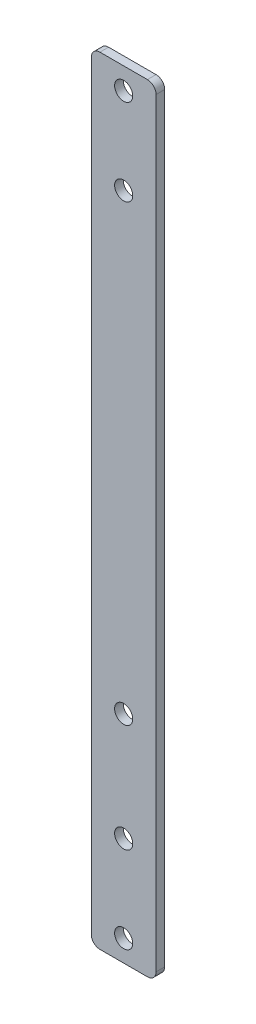
ISO-10303-21;
HEADER;
FILE_DESCRIPTION(('STEP AP214'),'2;1');
FILE_NAME('part.step','',(''),(''),'','','');
FILE_SCHEMA(('AUTOMOTIVE_DESIGN { 1 0 10303 214 1 1 1 1 }'));
ENDSEC;
DATA;
#1=APPLICATION_CONTEXT('core data for automotive mechanical design processes');
#2=APPLICATION_PROTOCOL_DEFINITION('international standard','automotive_design',2000,#1);
#3=PRODUCT_CONTEXT('',#1,'mechanical');
#4=PRODUCT('Part','Part','',(#3));
#5=PRODUCT_RELATED_PRODUCT_CATEGORY('part','',(#4));
#6=PRODUCT_DEFINITION_FORMATION('','',#4);
#7=PRODUCT_DEFINITION_CONTEXT('part definition',#1,'design');
#8=PRODUCT_DEFINITION('design','',#6,#7);
#9=PRODUCT_DEFINITION_SHAPE('','',#8);
#10=(LENGTH_UNIT() NAMED_UNIT(*) SI_UNIT(.MILLI.,.METRE.));
#11=(NAMED_UNIT(*) PLANE_ANGLE_UNIT() SI_UNIT($,.RADIAN.));
#12=(NAMED_UNIT(*) SI_UNIT($,.STERADIAN.) SOLID_ANGLE_UNIT());
#13=UNCERTAINTY_MEASURE_WITH_UNIT(LENGTH_MEASURE(1.E-05),#10,'distance_accuracy_value','');
#14=(GEOMETRIC_REPRESENTATION_CONTEXT(3) GLOBAL_UNCERTAINTY_ASSIGNED_CONTEXT((#13)) GLOBAL_UNIT_ASSIGNED_CONTEXT((#10,
#11,#12)) REPRESENTATION_CONTEXT('',''));
#15=CARTESIAN_POINT('',(0.,0.,0.));
#16=DIRECTION('',(0.,0.,1.));
#17=DIRECTION('',(1.,0.,0.));
#18=AXIS2_PLACEMENT_3D('',#15,#16,#17);
#19=CARTESIAN_POINT('',(-5.50000000000002,173.,2.));
#20=DIRECTION('',(0.,0.,1.));
#21=DIRECTION('',(1.,0.,0.));
#22=AXIS2_PLACEMENT_3D('',#19,#20,#21);
#23=PLANE('',#22);
#24=CARTESIAN_POINT('',(0.,45.,2.));
#25=DIRECTION('',(0.,0.,1.));
#26=DIRECTION('',(1.,0.,0.));
#27=AXIS2_PLACEMENT_3D('',#24,#25,#26);
#28=CIRCLE('',#27,2.1);
#29=CARTESIAN_POINT('',(2.1,45.,2.));
#30=VERTEX_POINT('',#29);
#31=EDGE_CURVE('E358',#30,#30,#28,.T.);
#32=ORIENTED_EDGE('',*,*,#31,.F.);
#33=EDGE_LOOP('',(#32));
#34=FACE_BOUND('',#33,.T.);
#35=CARTESIAN_POINT('',(0.,20.,2.));
#36=DIRECTION('',(0.,0.,1.));
#37=DIRECTION('',(1.,0.,0.));
#38=AXIS2_PLACEMENT_3D('',#35,#36,#37);
#39=CIRCLE('',#38,2.1);
#40=CARTESIAN_POINT('',(2.1,20.,2.));
#41=VERTEX_POINT('',#40);
#42=EDGE_CURVE('E347',#41,#41,#39,.F.);
#43=ORIENTED_EDGE('',*,*,#42,.T.);
#44=EDGE_LOOP('',(#43));
#45=FACE_BOUND('',#44,.T.);
#46=CARTESIAN_POINT('',(0.,0.,2.));
#47=DIRECTION('',(0.,0.,1.));
#48=DIRECTION('',(1.,0.,0.));
#49=AXIS2_PLACEMENT_3D('',#46,#47,#48);
#50=CIRCLE('',#49,2.10000000000001);
#51=CARTESIAN_POINT('',(2.09999999999994,0.,2.));
#52=VERTEX_POINT('',#51);
#53=EDGE_CURVE('E339',#52,#52,#50,.F.);
#54=ORIENTED_EDGE('',*,*,#53,.T.);
#55=EDGE_LOOP('',(#54));
#56=FACE_BOUND('',#55,.T.);
#57=CARTESIAN_POINT('',(0.,170.,2.));
#58=DIRECTION('',(0.,0.,1.));
#59=DIRECTION('',(1.,0.,0.));
#60=AXIS2_PLACEMENT_3D('',#57,#58,#59);
#61=CIRCLE('',#60,2.1);
#62=CARTESIAN_POINT('',(2.1,170.,2.));
#63=VERTEX_POINT('',#62);
#64=EDGE_CURVE('E260',#63,#63,#61,.T.);
#65=ORIENTED_EDGE('',*,*,#64,.F.);
#66=EDGE_LOOP('',(#65));
#67=FACE_BOUND('',#66,.T.);
#68=CARTESIAN_POINT('',(-5.50000000000002,173.,2.));
#69=DIRECTION('',(0.,0.,1.));
#70=DIRECTION('',(1.,0.,0.));
#71=AXIS2_PLACEMENT_3D('',#68,#69,#70);
#72=CIRCLE('',#71,2.);
#73=CARTESIAN_POINT('',(-5.50000000000001,175.,2.));
#74=VERTEX_POINT('',#73);
#75=CARTESIAN_POINT('',(-7.50000000000002,173.,2.));
#76=VERTEX_POINT('',#75);
#77=EDGE_CURVE('E282',#74,#76,#72,.T.);
#78=ORIENTED_EDGE('',*,*,#77,.T.);
#79=DIRECTION('',(0.,-1.,0.));
#80=VECTOR('',#79,1.);
#81=CARTESIAN_POINT('',(-7.50000000000002,173.,2.));
#82=LINE('',#81,#80);
#83=CARTESIAN_POINT('',(-7.50000000000006,-3.00000000000004,2.));
#84=VERTEX_POINT('',#83);
#85=EDGE_CURVE('E210',#76,#84,#82,.T.);
#86=ORIENTED_EDGE('',*,*,#85,.T.);
#87=CARTESIAN_POINT('',(-5.50000000000006,-3.00000000000006,2.));
#88=DIRECTION('',(0.,0.,1.));
#89=DIRECTION('',(1.,0.,0.));
#90=AXIS2_PLACEMENT_3D('',#87,#88,#89);
#91=CIRCLE('',#90,2.);
#92=CARTESIAN_POINT('',(-5.50000000000005,-5.00000000000006,2.));
#93=VERTEX_POINT('',#92);
#94=EDGE_CURVE('E304',#84,#93,#91,.T.);
#95=ORIENTED_EDGE('',*,*,#94,.T.);
#96=DIRECTION('',(1.,0.,0.));
#97=VECTOR('',#96,1.);
#98=CARTESIAN_POINT('',(-5.50000000000005,-5.00000000000006,2.));
#99=LINE('',#98,#97);
#100=CARTESIAN_POINT('',(5.5,-5.00000000000008,2.));
#101=VERTEX_POINT('',#100);
#102=EDGE_CURVE('E317',#93,#101,#99,.T.);
#103=ORIENTED_EDGE('',*,*,#102,.T.);
#104=CARTESIAN_POINT('',(5.50000000000002,-3.00000000000008,2.));
#105=DIRECTION('',(0.,0.,1.));
#106=DIRECTION('',(1.,0.,0.));
#107=AXIS2_PLACEMENT_3D('',#104,#105,#106);
#108=CIRCLE('',#107,2.);
#109=CARTESIAN_POINT('',(7.50000000000002,-3.00000000000008,2.));
#110=VERTEX_POINT('',#109);
#111=EDGE_CURVE('E244',#101,#110,#108,.T.);
#112=ORIENTED_EDGE('',*,*,#111,.T.);
#113=DIRECTION('',(0.,-1.,0.));
#114=VECTOR('',#113,1.);
#115=CARTESIAN_POINT('',(7.50000000000002,173.,2.));
#116=LINE('',#115,#114);
#117=CARTESIAN_POINT('',(7.50000000000002,173.,2.));
#118=VERTEX_POINT('',#117);
#119=EDGE_CURVE('E229',#118,#110,#116,.T.);
#120=ORIENTED_EDGE('',*,*,#119,.F.);
#121=CARTESIAN_POINT('',(5.50000000000002,173.,2.));
#122=DIRECTION('',(0.,0.,-1.));
#123=DIRECTION('',(-1.,0.,0.));
#124=AXIS2_PLACEMENT_3D('',#121,#122,#123);
#125=CIRCLE('',#124,2.);
#126=CARTESIAN_POINT('',(5.50000000000001,175.,2.));
#127=VERTEX_POINT('',#126);
#128=EDGE_CURVE('E242',#127,#118,#125,.T.);
#129=ORIENTED_EDGE('',*,*,#128,.F.);
#130=DIRECTION('',(1.,0.,0.));
#131=VECTOR('',#130,1.);
#132=CARTESIAN_POINT('',(-5.50000000000001,175.,2.));
#133=LINE('',#132,#131);
#134=EDGE_CURVE('E250',#74,#127,#133,.T.);
#135=ORIENTED_EDGE('',*,*,#134,.F.);
#136=EDGE_LOOP('',(#78,#86,#95,#103,#112,#120,#129,#135));
#137=FACE_BOUND('',#136,.T.);
#138=CARTESIAN_POINT('',(0.,150.,2.));
#139=DIRECTION('',(0.,0.,1.));
#140=DIRECTION('',(1.,0.,0.));
#141=AXIS2_PLACEMENT_3D('',#138,#139,#140);
#142=CIRCLE('',#141,2.1);
#143=CARTESIAN_POINT('',(2.1,150.,2.));
#144=VERTEX_POINT('',#143);
#145=EDGE_CURVE('E331',#144,#144,#142,.T.);
#146=ORIENTED_EDGE('',*,*,#145,.F.);
#147=EDGE_LOOP('',(#146));
#148=FACE_BOUND('',#147,.T.);
#149=ADVANCED_FACE('F153',(#34,#45,#56,#67,#137,#148),#23,.T.);
#150=CARTESIAN_POINT('',(-5.50000000000002,173.,0.));
#151=DIRECTION('',(0.,0.,1.));
#152=DIRECTION('',(1.,0.,0.));
#153=AXIS2_PLACEMENT_3D('',#150,#151,#152);
#154=PLANE('',#153);
#155=CARTESIAN_POINT('',(0.,45.,0.));
#156=DIRECTION('',(0.,0.,1.));
#157=DIRECTION('',(1.,0.,0.));
#158=AXIS2_PLACEMENT_3D('',#155,#156,#157);
#159=CIRCLE('',#158,2.1);
#160=CARTESIAN_POINT('',(2.1,45.,0.));
#161=VERTEX_POINT('',#160);
#162=EDGE_CURVE('E157',#161,#161,#159,.T.);
#163=ORIENTED_EDGE('',*,*,#162,.T.);
#164=EDGE_LOOP('',(#163));
#165=FACE_BOUND('',#164,.T.);
#166=CARTESIAN_POINT('',(0.,20.,0.));
#167=DIRECTION('',(0.,0.,1.));
#168=DIRECTION('',(1.,0.,0.));
#169=AXIS2_PLACEMENT_3D('',#166,#167,#168);
#170=CIRCLE('',#169,2.1);
#171=CARTESIAN_POINT('',(2.1,20.,0.));
#172=VERTEX_POINT('',#171);
#173=EDGE_CURVE('E351',#172,#172,#170,.F.);
#174=ORIENTED_EDGE('',*,*,#173,.F.);
#175=EDGE_LOOP('',(#174));
#176=FACE_BOUND('',#175,.T.);
#177=CARTESIAN_POINT('',(0.,0.,0.));
#178=DIRECTION('',(0.,0.,1.));
#179=DIRECTION('',(1.,0.,0.));
#180=AXIS2_PLACEMENT_3D('',#177,#178,#179);
#181=CIRCLE('',#180,2.10000000000001);
#182=CARTESIAN_POINT('',(2.09999999999994,0.,0.));
#183=VERTEX_POINT('',#182);
#184=EDGE_CURVE('E343',#183,#183,#181,.F.);
#185=ORIENTED_EDGE('',*,*,#184,.F.);
#186=EDGE_LOOP('',(#185));
#187=FACE_BOUND('',#186,.T.);
#188=CARTESIAN_POINT('',(-5.50000000000002,173.,0.));
#189=DIRECTION('',(0.,0.,1.));
#190=DIRECTION('',(1.,0.,0.));
#191=AXIS2_PLACEMENT_3D('',#188,#189,#190);
#192=CIRCLE('',#191,2.);
#193=CARTESIAN_POINT('',(-5.50000000000001,175.,0.));
#194=VERTEX_POINT('',#193);
#195=CARTESIAN_POINT('',(-7.50000000000002,173.,0.));
#196=VERTEX_POINT('',#195);
#197=EDGE_CURVE('E256',#194,#196,#192,.T.);
#198=ORIENTED_EDGE('',*,*,#197,.F.);
#199=DIRECTION('',(1.,0.,0.));
#200=VECTOR('',#199,1.);
#201=CARTESIAN_POINT('',(-5.50000000000001,175.,0.));
#202=LINE('',#201,#200);
#203=CARTESIAN_POINT('',(5.50000000000001,175.,0.));
#204=VERTEX_POINT('',#203);
#205=EDGE_CURVE('E278',#194,#204,#202,.T.);
#206=ORIENTED_EDGE('',*,*,#205,.T.);
#207=CARTESIAN_POINT('',(5.50000000000002,173.,0.));
#208=DIRECTION('',(0.,0.,-1.));
#209=DIRECTION('',(-1.,0.,0.));
#210=AXIS2_PLACEMENT_3D('',#207,#208,#209);
#211=CIRCLE('',#210,2.);
#212=CARTESIAN_POINT('',(7.50000000000002,173.,0.));
#213=VERTEX_POINT('',#212);
#214=EDGE_CURVE('E275',#204,#213,#211,.T.);
#215=ORIENTED_EDGE('',*,*,#214,.T.);
#216=DIRECTION('',(0.,-1.,0.));
#217=VECTOR('',#216,1.);
#218=CARTESIAN_POINT('',(7.50000000000002,173.,0.));
#219=LINE('',#218,#217);
#220=CARTESIAN_POINT('',(7.50000000000002,-3.00000000000008,0.));
#221=VERTEX_POINT('',#220);
#222=EDGE_CURVE('E231',#213,#221,#219,.T.);
#223=ORIENTED_EDGE('',*,*,#222,.T.);
#224=CARTESIAN_POINT('',(5.50000000000002,-3.00000000000008,0.));
#225=DIRECTION('',(0.,0.,1.));
#226=DIRECTION('',(1.,0.,0.));
#227=AXIS2_PLACEMENT_3D('',#224,#225,#226);
#228=CIRCLE('',#227,2.);
#229=CARTESIAN_POINT('',(5.5,-5.00000000000008,0.));
#230=VERTEX_POINT('',#229);
#231=EDGE_CURVE('E269',#230,#221,#228,.T.);
#232=ORIENTED_EDGE('',*,*,#231,.F.);
#233=DIRECTION('',(1.,0.,0.));
#234=VECTOR('',#233,1.);
#235=CARTESIAN_POINT('',(-5.50000000000005,-5.00000000000006,0.));
#236=LINE('',#235,#234);
#237=CARTESIAN_POINT('',(-5.50000000000005,-5.00000000000006,0.));
#238=VERTEX_POINT('',#237);
#239=EDGE_CURVE('E266',#238,#230,#236,.T.);
#240=ORIENTED_EDGE('',*,*,#239,.F.);
#241=CARTESIAN_POINT('',(-5.50000000000006,-3.00000000000006,0.));
#242=DIRECTION('',(0.,0.,1.));
#243=DIRECTION('',(1.,0.,0.));
#244=AXIS2_PLACEMENT_3D('',#241,#242,#243);
#245=CIRCLE('',#244,2.);
#246=CARTESIAN_POINT('',(-7.50000000000006,-3.00000000000004,0.));
#247=VERTEX_POINT('',#246);
#248=EDGE_CURVE('E263',#247,#238,#245,.T.);
#249=ORIENTED_EDGE('',*,*,#248,.F.);
#250=DIRECTION('',(0.,-1.,0.));
#251=VECTOR('',#250,1.);
#252=CARTESIAN_POINT('',(-7.50000000000002,173.,0.));
#253=LINE('',#252,#251);
#254=EDGE_CURVE('E259',#196,#247,#253,.T.);
#255=ORIENTED_EDGE('',*,*,#254,.F.);
#256=EDGE_LOOP('',(#198,#206,#215,#223,#232,#240,#249,#255));
#257=FACE_BOUND('',#256,.T.);
#258=CARTESIAN_POINT('',(0.,170.,0.));
#259=DIRECTION('',(0.,0.,1.));
#260=DIRECTION('',(1.,0.,0.));
#261=AXIS2_PLACEMENT_3D('',#258,#259,#260);
#262=CIRCLE('',#261,2.1);
#263=CARTESIAN_POINT('',(2.1,170.,0.));
#264=VERTEX_POINT('',#263);
#265=EDGE_CURVE('E327',#264,#264,#262,.T.);
#266=ORIENTED_EDGE('',*,*,#265,.T.);
#267=EDGE_LOOP('',(#266));
#268=FACE_BOUND('',#267,.T.);
#269=CARTESIAN_POINT('',(0.,150.,0.));
#270=DIRECTION('',(0.,0.,1.));
#271=DIRECTION('',(1.,0.,0.));
#272=AXIS2_PLACEMENT_3D('',#269,#270,#271);
#273=CIRCLE('',#272,2.1);
#274=CARTESIAN_POINT('',(2.1,150.,0.));
#275=VERTEX_POINT('',#274);
#276=EDGE_CURVE('E335',#275,#275,#273,.T.);
#277=ORIENTED_EDGE('',*,*,#276,.T.);
#278=EDGE_LOOP('',(#277));
#279=FACE_BOUND('',#278,.T.);
#280=ADVANCED_FACE('F307',(#165,#176,#187,#257,#268,#279),#154,.F.);
#281=CARTESIAN_POINT('',(-5.50000000000002,173.,2.));
#282=DIRECTION('',(0.,0.,-1.));
#283=DIRECTION('',(-1.,0.,0.));
#284=AXIS2_PLACEMENT_3D('',#281,#282,#283);
#285=CYLINDRICAL_SURFACE('',#284,2.);
#286=ORIENTED_EDGE('',*,*,#197,.T.);
#287=DIRECTION('',(0.,0.,-1.));
#288=VECTOR('',#287,1.);
#289=CARTESIAN_POINT('',(-7.50000000000002,173.,2.));
#290=LINE('',#289,#288);
#291=EDGE_CURVE('E12',#76,#196,#290,.T.);
#292=ORIENTED_EDGE('',*,*,#291,.F.);
#293=ORIENTED_EDGE('',*,*,#77,.F.);
#294=DIRECTION('',(0.,0.,-1.));
#295=VECTOR('',#294,1.);
#296=CARTESIAN_POINT('',(-5.50000000000001,175.,2.));
#297=LINE('',#296,#295);
#298=EDGE_CURVE('E172',#74,#194,#297,.T.);
#299=ORIENTED_EDGE('',*,*,#298,.T.);
#300=EDGE_LOOP('',(#286,#292,#293,#299));
#301=FACE_BOUND('',#300,.T.);
#302=ADVANCED_FACE('F155',(#301),#285,.T.);
#303=CARTESIAN_POINT('',(-7.50000000000002,173.,2.));
#304=DIRECTION('',(1.,0.,0.));
#305=DIRECTION('',(0.,1.,0.));
#306=AXIS2_PLACEMENT_3D('',#303,#304,#305);
#307=PLANE('',#306);
#308=ORIENTED_EDGE('',*,*,#254,.T.);
#309=DIRECTION('',(0.,0.,-1.));
#310=VECTOR('',#309,1.);
#311=CARTESIAN_POINT('',(-7.50000000000006,-3.00000000000004,2.));
#312=LINE('',#311,#310);
#313=EDGE_CURVE('E164',#84,#247,#312,.T.);
#314=ORIENTED_EDGE('',*,*,#313,.F.);
#315=ORIENTED_EDGE('',*,*,#85,.F.);
#316=ORIENTED_EDGE('',*,*,#291,.T.);
#317=EDGE_LOOP('',(#308,#314,#315,#316));
#318=FACE_BOUND('',#317,.T.);
#319=ADVANCED_FACE('F403',(#318),#307,.F.);
#320=CARTESIAN_POINT('',(-5.50000000000006,-3.00000000000006,2.));
#321=DIRECTION('',(0.,0.,-1.));
#322=DIRECTION('',(-1.,0.,0.));
#323=AXIS2_PLACEMENT_3D('',#320,#321,#322);
#324=CYLINDRICAL_SURFACE('',#323,2.);
#325=ORIENTED_EDGE('',*,*,#248,.T.);
#326=DIRECTION('',(0.,0.,-1.));
#327=VECTOR('',#326,1.);
#328=CARTESIAN_POINT('',(-5.50000000000005,-5.00000000000006,2.));
#329=LINE('',#328,#327);
#330=EDGE_CURVE('E293',#93,#238,#329,.T.);
#331=ORIENTED_EDGE('',*,*,#330,.F.);
#332=ORIENTED_EDGE('',*,*,#94,.F.);
#333=ORIENTED_EDGE('',*,*,#313,.T.);
#334=EDGE_LOOP('',(#325,#331,#332,#333));
#335=FACE_BOUND('',#334,.T.);
#336=ADVANCED_FACE('F302',(#335),#324,.T.);
#337=CARTESIAN_POINT('',(-5.50000000000005,-5.00000000000006,2.));
#338=DIRECTION('',(0.,1.,0.));
#339=DIRECTION('',(-1.,0.,0.));
#340=AXIS2_PLACEMENT_3D('',#337,#338,#339);
#341=PLANE('',#340);
#342=ORIENTED_EDGE('',*,*,#239,.T.);
#343=DIRECTION('',(0.,0.,-1.));
#344=VECTOR('',#343,1.);
#345=CARTESIAN_POINT('',(5.5,-5.00000000000008,2.));
#346=LINE('',#345,#344);
#347=EDGE_CURVE('E289',#101,#230,#346,.T.);
#348=ORIENTED_EDGE('',*,*,#347,.F.);
#349=ORIENTED_EDGE('',*,*,#102,.F.);
#350=ORIENTED_EDGE('',*,*,#330,.T.);
#351=EDGE_LOOP('',(#342,#348,#349,#350));
#352=FACE_BOUND('',#351,.T.);
#353=ADVANCED_FACE('F312',(#352),#341,.F.);
#354=CARTESIAN_POINT('',(5.50000000000002,-3.00000000000008,2.));
#355=DIRECTION('',(0.,0.,-1.));
#356=DIRECTION('',(-1.,0.,0.));
#357=AXIS2_PLACEMENT_3D('',#354,#355,#356);
#358=CYLINDRICAL_SURFACE('',#357,2.);
#359=ORIENTED_EDGE('',*,*,#231,.T.);
#360=DIRECTION('',(0.,0.,-1.));
#361=VECTOR('',#360,1.);
#362=CARTESIAN_POINT('',(7.50000000000002,-3.00000000000008,2.));
#363=LINE('',#362,#361);
#364=EDGE_CURVE('E236',#110,#221,#363,.T.);
#365=ORIENTED_EDGE('',*,*,#364,.F.);
#366=ORIENTED_EDGE('',*,*,#111,.F.);
#367=ORIENTED_EDGE('',*,*,#347,.T.);
#368=EDGE_LOOP('',(#359,#365,#366,#367));
#369=FACE_BOUND('',#368,.T.);
#370=ADVANCED_FACE('F315',(#369),#358,.T.);
#371=CARTESIAN_POINT('',(7.50000000000002,173.,2.));
#372=DIRECTION('',(1.,0.,0.));
#373=DIRECTION('',(0.,0.,-1.));
#374=AXIS2_PLACEMENT_3D('',#371,#372,#373);
#375=PLANE('',#374);
#376=ORIENTED_EDGE('',*,*,#222,.F.);
#377=DIRECTION('',(0.,0.,-1.));
#378=VECTOR('',#377,1.);
#379=CARTESIAN_POINT('',(7.50000000000002,173.,2.));
#380=LINE('',#379,#378);
#381=EDGE_CURVE('E226',#118,#213,#380,.T.);
#382=ORIENTED_EDGE('',*,*,#381,.F.);
#383=ORIENTED_EDGE('',*,*,#119,.T.);
#384=ORIENTED_EDGE('',*,*,#364,.T.);
#385=EDGE_LOOP('',(#376,#382,#383,#384));
#386=FACE_BOUND('',#385,.T.);
#387=ADVANCED_FACE('F228',(#386),#375,.T.);
#388=CARTESIAN_POINT('',(5.50000000000002,173.,2.));
#389=DIRECTION('',(0.,0.,-1.));
#390=DIRECTION('',(-1.,0.,0.));
#391=AXIS2_PLACEMENT_3D('',#388,#389,#390);
#392=CYLINDRICAL_SURFACE('',#391,2.);
#393=ORIENTED_EDGE('',*,*,#214,.F.);
#394=DIRECTION('',(0.,0.,-1.));
#395=VECTOR('',#394,1.);
#396=CARTESIAN_POINT('',(5.50000000000001,175.,2.));
#397=LINE('',#396,#395);
#398=EDGE_CURVE('E198',#127,#204,#397,.T.);
#399=ORIENTED_EDGE('',*,*,#398,.F.);
#400=ORIENTED_EDGE('',*,*,#128,.T.);
#401=ORIENTED_EDGE('',*,*,#381,.T.);
#402=EDGE_LOOP('',(#393,#399,#400,#401));
#403=FACE_BOUND('',#402,.T.);
#404=ADVANCED_FACE('F248',(#403),#392,.T.);
#405=CARTESIAN_POINT('',(-5.50000000000001,175.,2.));
#406=DIRECTION('',(0.,1.,0.));
#407=DIRECTION('',(0.,0.,1.));
#408=AXIS2_PLACEMENT_3D('',#405,#406,#407);
#409=PLANE('',#408);
#410=ORIENTED_EDGE('',*,*,#205,.F.);
#411=ORIENTED_EDGE('',*,*,#298,.F.);
#412=ORIENTED_EDGE('',*,*,#134,.T.);
#413=ORIENTED_EDGE('',*,*,#398,.T.);
#414=EDGE_LOOP('',(#410,#411,#412,#413));
#415=FACE_BOUND('',#414,.T.);
#416=ADVANCED_FACE('F391',(#415),#409,.T.);
#417=CARTESIAN_POINT('',(0.,170.,2.));
#418=DIRECTION('',(0.,0.,-1.));
#419=DIRECTION('',(-1.,0.,0.));
#420=AXIS2_PLACEMENT_3D('',#417,#418,#419);
#421=CYLINDRICAL_SURFACE('',#420,2.1);
#422=ORIENTED_EDGE('',*,*,#64,.T.);
#423=EDGE_LOOP('',(#422));
#424=FACE_BOUND('',#423,.T.);
#425=ORIENTED_EDGE('',*,*,#265,.F.);
#426=EDGE_LOOP('',(#425));
#427=FACE_BOUND('',#426,.T.);
#428=ADVANCED_FACE('F388',(#424,#427),#421,.F.);
#429=CARTESIAN_POINT('',(0.,150.,2.));
#430=DIRECTION('',(0.,0.,-1.));
#431=DIRECTION('',(-1.,0.,0.));
#432=AXIS2_PLACEMENT_3D('',#429,#430,#431);
#433=CYLINDRICAL_SURFACE('',#432,2.1);
#434=ORIENTED_EDGE('',*,*,#145,.T.);
#435=EDGE_LOOP('',(#434));
#436=FACE_BOUND('',#435,.T.);
#437=ORIENTED_EDGE('',*,*,#276,.F.);
#438=EDGE_LOOP('',(#437));
#439=FACE_BOUND('',#438,.T.);
#440=ADVANCED_FACE('F442',(#436,#439),#433,.F.);
#441=CARTESIAN_POINT('',(0.,0.,2.));
#442=DIRECTION('',(0.,0.,-1.));
#443=DIRECTION('',(-1.,0.,0.));
#444=AXIS2_PLACEMENT_3D('',#441,#442,#443);
#445=CYLINDRICAL_SURFACE('',#444,2.10000000000001);
#446=ORIENTED_EDGE('',*,*,#53,.F.);
#447=EDGE_LOOP('',(#446));
#448=FACE_BOUND('',#447,.T.);
#449=ORIENTED_EDGE('',*,*,#184,.T.);
#450=EDGE_LOOP('',(#449));
#451=FACE_BOUND('',#450,.T.);
#452=ADVANCED_FACE('F376',(#448,#451),#445,.F.);
#453=CARTESIAN_POINT('',(0.,20.,2.));
#454=DIRECTION('',(0.,0.,-1.));
#455=DIRECTION('',(-1.,0.,0.));
#456=AXIS2_PLACEMENT_3D('',#453,#454,#455);
#457=CYLINDRICAL_SURFACE('',#456,2.1);
#458=ORIENTED_EDGE('',*,*,#42,.F.);
#459=EDGE_LOOP('',(#458));
#460=FACE_BOUND('',#459,.T.);
#461=ORIENTED_EDGE('',*,*,#173,.T.);
#462=EDGE_LOOP('',(#461));
#463=FACE_BOUND('',#462,.T.);
#464=ADVANCED_FACE('F371',(#460,#463),#457,.F.);
#465=CARTESIAN_POINT('',(0.,45.,-8.));
#466=DIRECTION('',(0.,0.,1.));
#467=DIRECTION('',(1.,0.,0.));
#468=AXIS2_PLACEMENT_3D('',#465,#466,#467);
#469=CYLINDRICAL_SURFACE('',#468,2.1);
#470=ORIENTED_EDGE('',*,*,#31,.T.);
#471=EDGE_LOOP('',(#470));
#472=FACE_BOUND('',#471,.T.);
#473=ORIENTED_EDGE('',*,*,#162,.F.);
#474=EDGE_LOOP('',(#473));
#475=FACE_BOUND('',#474,.T.);
#476=ADVANCED_FACE('F369',(#472,#475),#469,.F.);
#477=CLOSED_SHELL('',(#149,#280,#302,#319,#336,#353,#370,#387,#404,#416,#428,#440,#452,#464,#476));
#478=MANIFOLD_SOLID_BREP('B2',#477);
#479=ADVANCED_BREP_SHAPE_REPRESENTATION('',(#18,#478),#14);
#480=SHAPE_DEFINITION_REPRESENTATION(#9,#479);
ENDSEC;
END-ISO-10303-21;
